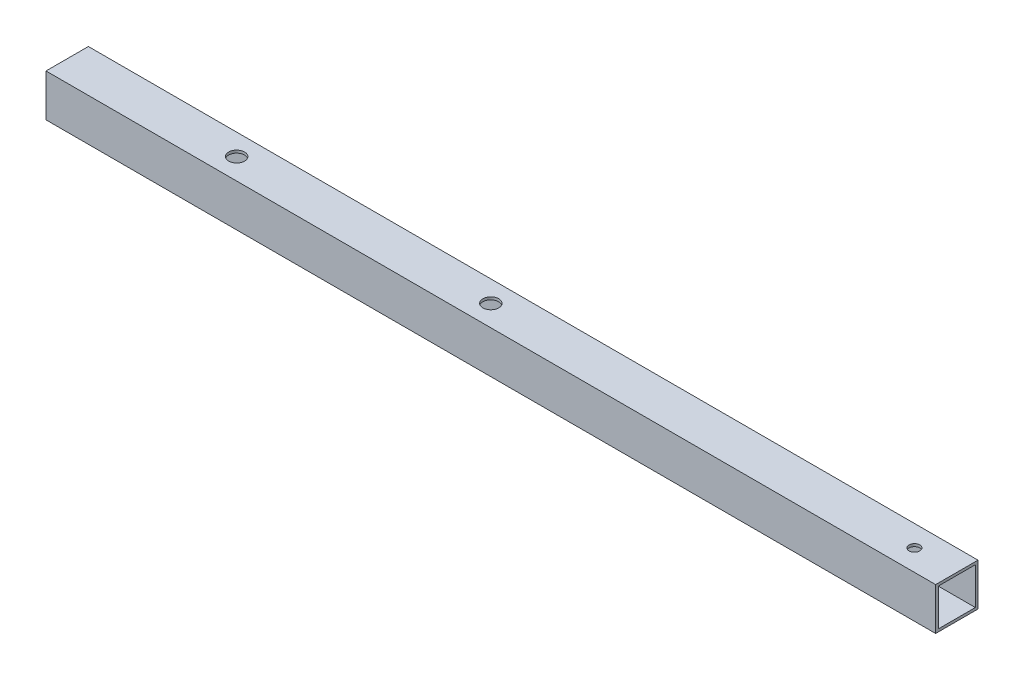
ISO-10303-21;
HEADER;
FILE_DESCRIPTION(('STEP AP214'),'2;1');
FILE_NAME('part.step','',(''),(''),'','','');
FILE_SCHEMA(('AUTOMOTIVE_DESIGN { 1 0 10303 214 1 1 1 1 }'));
ENDSEC;
DATA;
#1=APPLICATION_CONTEXT('core data for automotive mechanical design processes');
#2=APPLICATION_PROTOCOL_DEFINITION('international standard','automotive_design',2000,#1);
#3=PRODUCT_CONTEXT('',#1,'mechanical');
#4=PRODUCT('Part','Part','',(#3));
#5=PRODUCT_RELATED_PRODUCT_CATEGORY('part','',(#4));
#6=PRODUCT_DEFINITION_FORMATION('','',#4);
#7=PRODUCT_DEFINITION_CONTEXT('part definition',#1,'design');
#8=PRODUCT_DEFINITION('design','',#6,#7);
#9=PRODUCT_DEFINITION_SHAPE('','',#8);
#10=(LENGTH_UNIT() NAMED_UNIT(*) SI_UNIT(.MILLI.,.METRE.));
#11=(NAMED_UNIT(*) PLANE_ANGLE_UNIT() SI_UNIT($,.RADIAN.));
#12=(NAMED_UNIT(*) SI_UNIT($,.STERADIAN.) SOLID_ANGLE_UNIT());
#13=UNCERTAINTY_MEASURE_WITH_UNIT(LENGTH_MEASURE(1.E-05),#10,'distance_accuracy_value','');
#14=(GEOMETRIC_REPRESENTATION_CONTEXT(3) GLOBAL_UNCERTAINTY_ASSIGNED_CONTEXT((#13)) GLOBAL_UNIT_ASSIGNED_CONTEXT((#10,
#11,#12)) REPRESENTATION_CONTEXT('',''));
#15=CARTESIAN_POINT('',(0.,0.,0.));
#16=DIRECTION('',(0.,0.,1.));
#17=DIRECTION('',(1.,0.,0.));
#18=AXIS2_PLACEMENT_3D('',#15,#16,#17);
#19=CARTESIAN_POINT('',(533.4,0.,0.));
#20=DIRECTION('',(-1.,0.,0.));
#21=DIRECTION('',(0.,0.,1.));
#22=AXIS2_PLACEMENT_3D('',#19,#20,#21);
#23=PLANE('',#22);
#24=DIRECTION('',(0.,1.,0.));
#25=VECTOR('',#24,1.);
#26=CARTESIAN_POINT('',(533.4,-12.7,-12.7));
#27=LINE('',#26,#25);
#28=CARTESIAN_POINT('',(533.4,-12.7,-12.7));
#29=VERTEX_POINT('',#28);
#30=CARTESIAN_POINT('',(533.4,12.7,-12.7));
#31=VERTEX_POINT('',#30);
#32=EDGE_CURVE('E137',#29,#31,#27,.T.);
#33=ORIENTED_EDGE('',*,*,#32,.T.);
#34=DIRECTION('',(0.,0.,1.));
#35=VECTOR('',#34,1.);
#36=CARTESIAN_POINT('',(533.4,12.7,12.7));
#37=LINE('',#36,#35);
#38=CARTESIAN_POINT('',(533.4,12.7,12.7));
#39=VERTEX_POINT('',#38);
#40=EDGE_CURVE('E140',#31,#39,#37,.T.);
#41=ORIENTED_EDGE('',*,*,#40,.T.);
#42=DIRECTION('',(0.,-1.,0.));
#43=VECTOR('',#42,1.);
#44=CARTESIAN_POINT('',(533.4,-12.7,12.7));
#45=LINE('',#44,#43);
#46=CARTESIAN_POINT('',(533.4,-12.7,12.7));
#47=VERTEX_POINT('',#46);
#48=EDGE_CURVE('E143',#39,#47,#45,.T.);
#49=ORIENTED_EDGE('',*,*,#48,.T.);
#50=DIRECTION('',(0.,0.,-1.));
#51=VECTOR('',#50,1.);
#52=CARTESIAN_POINT('',(533.4,-12.7,12.7));
#53=LINE('',#52,#51);
#54=EDGE_CURVE('E145',#47,#29,#53,.T.);
#55=ORIENTED_EDGE('',*,*,#54,.T.);
#56=EDGE_LOOP('',(#33,#41,#49,#55));
#57=FACE_BOUND('',#56,.T.);
#58=DIRECTION('',(0.,1.,0.));
#59=VECTOR('',#58,1.);
#60=CARTESIAN_POINT('',(533.4,-11.1125,-11.1125));
#61=LINE('',#60,#59);
#62=CARTESIAN_POINT('',(533.4,-11.1125,-11.1125));
#63=VERTEX_POINT('',#62);
#64=CARTESIAN_POINT('',(533.4,11.1125,-11.1125));
#65=VERTEX_POINT('',#64);
#66=EDGE_CURVE('E99',#63,#65,#61,.T.);
#67=ORIENTED_EDGE('',*,*,#66,.F.);
#68=DIRECTION('',(0.,0.,-1.));
#69=VECTOR('',#68,1.);
#70=CARTESIAN_POINT('',(533.4,-11.1125,11.1125));
#71=LINE('',#70,#69);
#72=CARTESIAN_POINT('',(533.4,-11.1125,11.1125));
#73=VERTEX_POINT('',#72);
#74=EDGE_CURVE('E121',#73,#63,#71,.T.);
#75=ORIENTED_EDGE('',*,*,#74,.F.);
#76=DIRECTION('',(0.,-1.,0.));
#77=VECTOR('',#76,1.);
#78=CARTESIAN_POINT('',(533.4,-11.1125,11.1125));
#79=LINE('',#78,#77);
#80=CARTESIAN_POINT('',(533.4,11.1125,11.1125));
#81=VERTEX_POINT('',#80);
#82=EDGE_CURVE('E119',#81,#73,#79,.T.);
#83=ORIENTED_EDGE('',*,*,#82,.F.);
#84=DIRECTION('',(0.,0.,1.));
#85=VECTOR('',#84,1.);
#86=CARTESIAN_POINT('',(533.4,11.1125,11.1125));
#87=LINE('',#86,#85);
#88=EDGE_CURVE('E107',#65,#81,#87,.T.);
#89=ORIENTED_EDGE('',*,*,#88,.F.);
#90=EDGE_LOOP('',(#67,#75,#83,#89));
#91=FACE_BOUND('',#90,.T.);
#92=ADVANCED_FACE('F32',(#57,#91),#23,.F.);
#93=CARTESIAN_POINT('',(0.,0.,0.));
#94=DIRECTION('',(-1.,0.,0.));
#95=DIRECTION('',(0.,0.,1.));
#96=AXIS2_PLACEMENT_3D('',#93,#94,#95);
#97=PLANE('',#96);
#98=DIRECTION('',(0.,1.,0.));
#99=VECTOR('',#98,1.);
#100=CARTESIAN_POINT('',(0.,-12.7,-12.7));
#101=LINE('',#100,#99);
#102=CARTESIAN_POINT('',(0.,-12.7,-12.7));
#103=VERTEX_POINT('',#102);
#104=CARTESIAN_POINT('',(0.,12.7,-12.7));
#105=VERTEX_POINT('',#104);
#106=EDGE_CURVE('E115',#103,#105,#101,.T.);
#107=ORIENTED_EDGE('',*,*,#106,.F.);
#108=DIRECTION('',(0.,0.,-1.));
#109=VECTOR('',#108,1.);
#110=CARTESIAN_POINT('',(0.,-12.7,12.7));
#111=LINE('',#110,#109);
#112=CARTESIAN_POINT('',(0.,-12.7,12.7));
#113=VERTEX_POINT('',#112);
#114=EDGE_CURVE('E141',#113,#103,#111,.T.);
#115=ORIENTED_EDGE('',*,*,#114,.F.);
#116=DIRECTION('',(0.,-1.,0.));
#117=VECTOR('',#116,1.);
#118=CARTESIAN_POINT('',(0.,-12.7,12.7));
#119=LINE('',#118,#117);
#120=CARTESIAN_POINT('',(0.,12.7,12.7));
#121=VERTEX_POINT('',#120);
#122=EDGE_CURVE('E152',#121,#113,#119,.T.);
#123=ORIENTED_EDGE('',*,*,#122,.F.);
#124=DIRECTION('',(0.,0.,1.));
#125=VECTOR('',#124,1.);
#126=CARTESIAN_POINT('',(0.,12.7,12.7));
#127=LINE('',#126,#125);
#128=EDGE_CURVE('E150',#105,#121,#127,.T.);
#129=ORIENTED_EDGE('',*,*,#128,.F.);
#130=EDGE_LOOP('',(#107,#115,#123,#129));
#131=FACE_BOUND('',#130,.T.);
#132=DIRECTION('',(0.,0.,-1.));
#133=VECTOR('',#132,1.);
#134=CARTESIAN_POINT('',(0.,-11.1125,11.1125));
#135=LINE('',#134,#133);
#136=CARTESIAN_POINT('',(0.,-11.1125,11.1125));
#137=VERTEX_POINT('',#136);
#138=CARTESIAN_POINT('',(0.,-11.1125,-11.1125));
#139=VERTEX_POINT('',#138);
#140=EDGE_CURVE('E108',#137,#139,#135,.T.);
#141=ORIENTED_EDGE('',*,*,#140,.T.);
#142=DIRECTION('',(0.,1.,0.));
#143=VECTOR('',#142,1.);
#144=CARTESIAN_POINT('',(0.,-11.1125,-11.1125));
#145=LINE('',#144,#143);
#146=CARTESIAN_POINT('',(0.,11.1125,-11.1125));
#147=VERTEX_POINT('',#146);
#148=EDGE_CURVE('E57',#139,#147,#145,.T.);
#149=ORIENTED_EDGE('',*,*,#148,.T.);
#150=DIRECTION('',(0.,0.,1.));
#151=VECTOR('',#150,1.);
#152=CARTESIAN_POINT('',(0.,11.1125,11.1125));
#153=LINE('',#152,#151);
#154=CARTESIAN_POINT('',(0.,11.1125,11.1125));
#155=VERTEX_POINT('',#154);
#156=EDGE_CURVE('E114',#147,#155,#153,.T.);
#157=ORIENTED_EDGE('',*,*,#156,.T.);
#158=DIRECTION('',(0.,-1.,0.));
#159=VECTOR('',#158,1.);
#160=CARTESIAN_POINT('',(0.,-11.1125,11.1125));
#161=LINE('',#160,#159);
#162=EDGE_CURVE('E129',#155,#137,#161,.T.);
#163=ORIENTED_EDGE('',*,*,#162,.T.);
#164=EDGE_LOOP('',(#141,#149,#157,#163));
#165=FACE_BOUND('',#164,.T.);
#166=ADVANCED_FACE('F210',(#131,#165),#97,.T.);
#167=CARTESIAN_POINT('',(533.4,-12.7,-12.7));
#168=DIRECTION('',(0.,0.,1.));
#169=DIRECTION('',(1.,0.,0.));
#170=AXIS2_PLACEMENT_3D('',#167,#168,#169);
#171=PLANE('',#170);
#172=ORIENTED_EDGE('',*,*,#106,.T.);
#173=DIRECTION('',(-1.,0.,0.));
#174=VECTOR('',#173,1.);
#175=CARTESIAN_POINT('',(533.4,12.7,-12.7));
#176=LINE('',#175,#174);
#177=EDGE_CURVE('E11',#31,#105,#176,.T.);
#178=ORIENTED_EDGE('',*,*,#177,.F.);
#179=ORIENTED_EDGE('',*,*,#32,.F.);
#180=DIRECTION('',(-1.,0.,0.));
#181=VECTOR('',#180,1.);
#182=CARTESIAN_POINT('',(533.4,-12.7,-12.7));
#183=LINE('',#182,#181);
#184=EDGE_CURVE('E147',#29,#103,#183,.T.);
#185=ORIENTED_EDGE('',*,*,#184,.T.);
#186=EDGE_LOOP('',(#172,#178,#179,#185));
#187=FACE_BOUND('',#186,.T.);
#188=ADVANCED_FACE('F34',(#187),#171,.F.);
#189=CARTESIAN_POINT('',(533.4,12.7,12.7));
#190=DIRECTION('',(0.,-1.,0.));
#191=DIRECTION('',(0.,0.,-1.));
#192=AXIS2_PLACEMENT_3D('',#189,#190,#191);
#193=PLANE('',#192);
#194=CARTESIAN_POINT('',(508.,12.7,0.));
#195=DIRECTION('',(0.,1.,0.));
#196=DIRECTION('',(0.,0.,1.));
#197=AXIS2_PLACEMENT_3D('',#194,#195,#196);
#198=CIRCLE('',#197,3.17499999999997);
#199=CARTESIAN_POINT('',(508.,12.7,3.17499999999997));
#200=VERTEX_POINT('',#199);
#201=EDGE_CURVE('E235',#200,#200,#198,.T.);
#202=ORIENTED_EDGE('',*,*,#201,.F.);
#203=EDGE_LOOP('',(#202));
#204=FACE_BOUND('',#203,.T.);
#205=CARTESIAN_POINT('',(254.,12.7,0.));
#206=DIRECTION('',(0.,1.,0.));
#207=DIRECTION('',(0.,0.,1.));
#208=AXIS2_PLACEMENT_3D('',#205,#206,#207);
#209=CIRCLE('',#208,4.76250000000001);
#210=CARTESIAN_POINT('',(254.,12.7,4.76250000000001));
#211=VERTEX_POINT('',#210);
#212=EDGE_CURVE('E175',#211,#211,#209,.T.);
#213=ORIENTED_EDGE('',*,*,#212,.F.);
#214=EDGE_LOOP('',(#213));
#215=FACE_BOUND('',#214,.T.);
#216=CARTESIAN_POINT('',(101.6,12.7,0.));
#217=DIRECTION('',(0.,1.,0.));
#218=DIRECTION('',(0.,0.,1.));
#219=AXIS2_PLACEMENT_3D('',#216,#217,#218);
#220=CIRCLE('',#219,4.7625);
#221=CARTESIAN_POINT('',(101.6,12.7,4.7625));
#222=VERTEX_POINT('',#221);
#223=EDGE_CURVE('E172',#222,#222,#220,.T.);
#224=ORIENTED_EDGE('',*,*,#223,.F.);
#225=EDGE_LOOP('',(#224));
#226=FACE_BOUND('',#225,.T.);
#227=ORIENTED_EDGE('',*,*,#128,.T.);
#228=DIRECTION('',(-1.,0.,0.));
#229=VECTOR('',#228,1.);
#230=CARTESIAN_POINT('',(533.4,12.7,12.7));
#231=LINE('',#230,#229);
#232=EDGE_CURVE('E41',#39,#121,#231,.T.);
#233=ORIENTED_EDGE('',*,*,#232,.F.);
#234=ORIENTED_EDGE('',*,*,#40,.F.);
#235=ORIENTED_EDGE('',*,*,#177,.T.);
#236=EDGE_LOOP('',(#227,#233,#234,#235));
#237=FACE_BOUND('',#236,.T.);
#238=ADVANCED_FACE('F224',(#204,#215,#226,#237),#193,.F.);
#239=CARTESIAN_POINT('',(533.4,-12.7,12.7));
#240=DIRECTION('',(0.,0.,-1.));
#241=DIRECTION('',(-1.,0.,0.));
#242=AXIS2_PLACEMENT_3D('',#239,#240,#241);
#243=PLANE('',#242);
#244=ORIENTED_EDGE('',*,*,#122,.T.);
#245=DIRECTION('',(-1.,0.,0.));
#246=VECTOR('',#245,1.);
#247=CARTESIAN_POINT('',(533.4,-12.7,12.7));
#248=LINE('',#247,#246);
#249=EDGE_CURVE('E157',#47,#113,#248,.T.);
#250=ORIENTED_EDGE('',*,*,#249,.F.);
#251=ORIENTED_EDGE('',*,*,#48,.F.);
#252=ORIENTED_EDGE('',*,*,#232,.T.);
#253=EDGE_LOOP('',(#244,#250,#251,#252));
#254=FACE_BOUND('',#253,.T.);
#255=ADVANCED_FACE('F221',(#254),#243,.F.);
#256=CARTESIAN_POINT('',(533.4,-12.7,12.7));
#257=DIRECTION('',(0.,1.,0.));
#258=DIRECTION('',(0.,0.,1.));
#259=AXIS2_PLACEMENT_3D('',#256,#257,#258);
#260=PLANE('',#259);
#261=CARTESIAN_POINT('',(508.,-12.7,0.));
#262=DIRECTION('',(0.,1.,0.));
#263=DIRECTION('',(0.,0.,1.));
#264=AXIS2_PLACEMENT_3D('',#261,#262,#263);
#265=CIRCLE('',#264,3.17499999999997);
#266=CARTESIAN_POINT('',(508.,-12.7,3.17499999999997));
#267=VERTEX_POINT('',#266);
#268=EDGE_CURVE('E283',#267,#267,#265,.T.);
#269=ORIENTED_EDGE('',*,*,#268,.T.);
#270=EDGE_LOOP('',(#269));
#271=FACE_BOUND('',#270,.T.);
#272=CARTESIAN_POINT('',(254.,-12.7,0.));
#273=DIRECTION('',(0.,1.,0.));
#274=DIRECTION('',(0.,0.,1.));
#275=AXIS2_PLACEMENT_3D('',#272,#273,#274);
#276=CIRCLE('',#275,4.76250000000001);
#277=CARTESIAN_POINT('',(254.,-12.7,4.76250000000001));
#278=VERTEX_POINT('',#277);
#279=EDGE_CURVE('E168',#278,#278,#276,.T.);
#280=ORIENTED_EDGE('',*,*,#279,.T.);
#281=EDGE_LOOP('',(#280));
#282=FACE_BOUND('',#281,.T.);
#283=CARTESIAN_POINT('',(101.6,-12.7,0.));
#284=DIRECTION('',(0.,1.,0.));
#285=DIRECTION('',(0.,0.,1.));
#286=AXIS2_PLACEMENT_3D('',#283,#284,#285);
#287=CIRCLE('',#286,4.7625);
#288=CARTESIAN_POINT('',(101.6,-12.7,4.7625));
#289=VERTEX_POINT('',#288);
#290=EDGE_CURVE('E164',#289,#289,#287,.T.);
#291=ORIENTED_EDGE('',*,*,#290,.T.);
#292=EDGE_LOOP('',(#291));
#293=FACE_BOUND('',#292,.T.);
#294=ORIENTED_EDGE('',*,*,#114,.T.);
#295=ORIENTED_EDGE('',*,*,#184,.F.);
#296=ORIENTED_EDGE('',*,*,#54,.F.);
#297=ORIENTED_EDGE('',*,*,#249,.T.);
#298=EDGE_LOOP('',(#294,#295,#296,#297));
#299=FACE_BOUND('',#298,.T.);
#300=ADVANCED_FACE('F205',(#271,#282,#293,#299),#260,.F.);
#301=CARTESIAN_POINT('',(533.4,-11.1125,-11.1125));
#302=DIRECTION('',(0.,0.,1.));
#303=DIRECTION('',(1.,0.,0.));
#304=AXIS2_PLACEMENT_3D('',#301,#302,#303);
#305=PLANE('',#304);
#306=ORIENTED_EDGE('',*,*,#148,.F.);
#307=DIRECTION('',(-1.,0.,0.));
#308=VECTOR('',#307,1.);
#309=CARTESIAN_POINT('',(533.4,-11.1125,-11.1125));
#310=LINE('',#309,#308);
#311=EDGE_CURVE('E103',#63,#139,#310,.T.);
#312=ORIENTED_EDGE('',*,*,#311,.F.);
#313=ORIENTED_EDGE('',*,*,#66,.T.);
#314=DIRECTION('',(-1.,0.,0.));
#315=VECTOR('',#314,1.);
#316=CARTESIAN_POINT('',(533.4,11.1125,-11.1125));
#317=LINE('',#316,#315);
#318=EDGE_CURVE('E102',#65,#147,#317,.T.);
#319=ORIENTED_EDGE('',*,*,#318,.T.);
#320=EDGE_LOOP('',(#306,#312,#313,#319));
#321=FACE_BOUND('',#320,.T.);
#322=ADVANCED_FACE('F101',(#321),#305,.T.);
#323=CARTESIAN_POINT('',(533.4,11.1125,11.1125));
#324=DIRECTION('',(0.,-1.,0.));
#325=DIRECTION('',(0.,0.,-1.));
#326=AXIS2_PLACEMENT_3D('',#323,#324,#325);
#327=PLANE('',#326);
#328=CARTESIAN_POINT('',(508.,11.1125,0.));
#329=DIRECTION('',(0.,-1.,0.));
#330=DIRECTION('',(0.,0.,-1.));
#331=AXIS2_PLACEMENT_3D('',#328,#329,#330);
#332=CIRCLE('',#331,3.17499999999997);
#333=CARTESIAN_POINT('',(508.,11.1125,-3.17499999999997));
#334=VERTEX_POINT('',#333);
#335=EDGE_CURVE('E180',#334,#334,#332,.T.);
#336=ORIENTED_EDGE('',*,*,#335,.F.);
#337=EDGE_LOOP('',(#336));
#338=FACE_BOUND('',#337,.T.);
#339=CARTESIAN_POINT('',(254.,11.1125,0.));
#340=DIRECTION('',(0.,-1.,0.));
#341=DIRECTION('',(0.,0.,-1.));
#342=AXIS2_PLACEMENT_3D('',#339,#340,#341);
#343=CIRCLE('',#342,4.76250000000001);
#344=CARTESIAN_POINT('',(254.,11.1125,-4.76250000000001));
#345=VERTEX_POINT('',#344);
#346=EDGE_CURVE('E167',#345,#345,#343,.T.);
#347=ORIENTED_EDGE('',*,*,#346,.F.);
#348=EDGE_LOOP('',(#347));
#349=FACE_BOUND('',#348,.T.);
#350=CARTESIAN_POINT('',(101.6,11.1125,0.));
#351=DIRECTION('',(0.,-1.,0.));
#352=DIRECTION('',(0.,0.,-1.));
#353=AXIS2_PLACEMENT_3D('',#350,#351,#352);
#354=CIRCLE('',#353,4.7625);
#355=CARTESIAN_POINT('',(101.6,11.1125,-4.7625));
#356=VERTEX_POINT('',#355);
#357=EDGE_CURVE('E127',#356,#356,#354,.T.);
#358=ORIENTED_EDGE('',*,*,#357,.F.);
#359=EDGE_LOOP('',(#358));
#360=FACE_BOUND('',#359,.T.);
#361=ORIENTED_EDGE('',*,*,#156,.F.);
#362=ORIENTED_EDGE('',*,*,#318,.F.);
#363=ORIENTED_EDGE('',*,*,#88,.T.);
#364=DIRECTION('',(-1.,0.,0.));
#365=VECTOR('',#364,1.);
#366=CARTESIAN_POINT('',(533.4,11.1125,11.1125));
#367=LINE('',#366,#365);
#368=EDGE_CURVE('E116',#81,#155,#367,.T.);
#369=ORIENTED_EDGE('',*,*,#368,.T.);
#370=EDGE_LOOP('',(#361,#362,#363,#369));
#371=FACE_BOUND('',#370,.T.);
#372=ADVANCED_FACE('F111',(#338,#349,#360,#371),#327,.T.);
#373=CARTESIAN_POINT('',(533.4,-11.1125,11.1125));
#374=DIRECTION('',(0.,0.,-1.));
#375=DIRECTION('',(-1.,0.,0.));
#376=AXIS2_PLACEMENT_3D('',#373,#374,#375);
#377=PLANE('',#376);
#378=ORIENTED_EDGE('',*,*,#162,.F.);
#379=ORIENTED_EDGE('',*,*,#368,.F.);
#380=ORIENTED_EDGE('',*,*,#82,.T.);
#381=DIRECTION('',(-1.,0.,0.));
#382=VECTOR('',#381,1.);
#383=CARTESIAN_POINT('',(533.4,-11.1125,11.1125));
#384=LINE('',#383,#382);
#385=EDGE_CURVE('E49',#73,#137,#384,.T.);
#386=ORIENTED_EDGE('',*,*,#385,.T.);
#387=EDGE_LOOP('',(#378,#379,#380,#386));
#388=FACE_BOUND('',#387,.T.);
#389=ADVANCED_FACE('F195',(#388),#377,.T.);
#390=CARTESIAN_POINT('',(533.4,-11.1125,11.1125));
#391=DIRECTION('',(0.,1.,0.));
#392=DIRECTION('',(0.,0.,1.));
#393=AXIS2_PLACEMENT_3D('',#390,#391,#392);
#394=PLANE('',#393);
#395=CARTESIAN_POINT('',(508.,-11.1125,0.));
#396=DIRECTION('',(0.,1.,0.));
#397=DIRECTION('',(0.,0.,1.));
#398=AXIS2_PLACEMENT_3D('',#395,#396,#397);
#399=CIRCLE('',#398,3.17499999999997);
#400=CARTESIAN_POINT('',(508.,-11.1125,3.17499999999997));
#401=VERTEX_POINT('',#400);
#402=EDGE_CURVE('E36',#401,#401,#399,.T.);
#403=ORIENTED_EDGE('',*,*,#402,.F.);
#404=EDGE_LOOP('',(#403));
#405=FACE_BOUND('',#404,.T.);
#406=CARTESIAN_POINT('',(254.,-11.1125,0.));
#407=DIRECTION('',(0.,1.,0.));
#408=DIRECTION('',(0.,0.,1.));
#409=AXIS2_PLACEMENT_3D('',#406,#407,#408);
#410=CIRCLE('',#409,4.76250000000001);
#411=CARTESIAN_POINT('',(254.,-11.1125,4.76250000000001));
#412=VERTEX_POINT('',#411);
#413=EDGE_CURVE('E165',#412,#412,#410,.T.);
#414=ORIENTED_EDGE('',*,*,#413,.F.);
#415=EDGE_LOOP('',(#414));
#416=FACE_BOUND('',#415,.T.);
#417=CARTESIAN_POINT('',(101.6,-11.1125,0.));
#418=DIRECTION('',(0.,1.,0.));
#419=DIRECTION('',(0.,0.,1.));
#420=AXIS2_PLACEMENT_3D('',#417,#418,#419);
#421=CIRCLE('',#420,4.7625);
#422=CARTESIAN_POINT('',(101.6,-11.1125,4.7625));
#423=VERTEX_POINT('',#422);
#424=EDGE_CURVE('E162',#423,#423,#421,.T.);
#425=ORIENTED_EDGE('',*,*,#424,.F.);
#426=EDGE_LOOP('',(#425));
#427=FACE_BOUND('',#426,.T.);
#428=ORIENTED_EDGE('',*,*,#140,.F.);
#429=ORIENTED_EDGE('',*,*,#385,.F.);
#430=ORIENTED_EDGE('',*,*,#74,.T.);
#431=ORIENTED_EDGE('',*,*,#311,.T.);
#432=EDGE_LOOP('',(#428,#429,#430,#431));
#433=FACE_BOUND('',#432,.T.);
#434=ADVANCED_FACE('F202',(#405,#416,#427,#433),#394,.T.);
#435=CARTESIAN_POINT('',(101.6,-12.7,0.));
#436=DIRECTION('',(0.,1.,0.));
#437=DIRECTION('',(0.,0.,1.));
#438=AXIS2_PLACEMENT_3D('',#435,#436,#437);
#439=CYLINDRICAL_SURFACE('',#438,4.7625);
#440=ORIENTED_EDGE('',*,*,#424,.T.);
#441=EDGE_LOOP('',(#440));
#442=FACE_BOUND('',#441,.T.);
#443=ORIENTED_EDGE('',*,*,#290,.F.);
#444=EDGE_LOOP('',(#443));
#445=FACE_BOUND('',#444,.T.);
#446=ADVANCED_FACE('F254',(#442,#445),#439,.F.);
#447=ORIENTED_EDGE('',*,*,#357,.T.);
#448=EDGE_LOOP('',(#447));
#449=FACE_BOUND('',#448,.T.);
#450=ORIENTED_EDGE('',*,*,#223,.T.);
#451=EDGE_LOOP('',(#450));
#452=FACE_BOUND('',#451,.T.);
#453=ADVANCED_FACE('F191',(#449,#452),#439,.F.);
#454=CARTESIAN_POINT('',(254.,-12.7,0.));
#455=DIRECTION('',(0.,1.,0.));
#456=DIRECTION('',(0.,0.,1.));
#457=AXIS2_PLACEMENT_3D('',#454,#455,#456);
#458=CYLINDRICAL_SURFACE('',#457,4.76250000000001);
#459=ORIENTED_EDGE('',*,*,#413,.T.);
#460=EDGE_LOOP('',(#459));
#461=FACE_BOUND('',#460,.T.);
#462=ORIENTED_EDGE('',*,*,#279,.F.);
#463=EDGE_LOOP('',(#462));
#464=FACE_BOUND('',#463,.T.);
#465=ADVANCED_FACE('F265',(#461,#464),#458,.F.);
#466=ORIENTED_EDGE('',*,*,#346,.T.);
#467=EDGE_LOOP('',(#466));
#468=FACE_BOUND('',#467,.T.);
#469=ORIENTED_EDGE('',*,*,#212,.T.);
#470=EDGE_LOOP('',(#469));
#471=FACE_BOUND('',#470,.T.);
#472=ADVANCED_FACE('F268',(#468,#471),#458,.F.);
#473=CARTESIAN_POINT('',(508.,-12.7,0.));
#474=DIRECTION('',(0.,1.,0.));
#475=DIRECTION('',(0.,0.,1.));
#476=AXIS2_PLACEMENT_3D('',#473,#474,#475);
#477=CYLINDRICAL_SURFACE('',#476,3.17499999999997);
#478=ORIENTED_EDGE('',*,*,#402,.T.);
#479=EDGE_LOOP('',(#478));
#480=FACE_BOUND('',#479,.T.);
#481=ORIENTED_EDGE('',*,*,#268,.F.);
#482=EDGE_LOOP('',(#481));
#483=FACE_BOUND('',#482,.T.);
#484=ADVANCED_FACE('F269',(#480,#483),#477,.F.);
#485=ORIENTED_EDGE('',*,*,#335,.T.);
#486=EDGE_LOOP('',(#485));
#487=FACE_BOUND('',#486,.T.);
#488=ORIENTED_EDGE('',*,*,#201,.T.);
#489=EDGE_LOOP('',(#488));
#490=FACE_BOUND('',#489,.T.);
#491=ADVANCED_FACE('F271',(#487,#490),#477,.F.);
#492=CLOSED_SHELL('',(#92,#166,#188,#238,#255,#300,#322,#372,#389,#434,#446,#453,#465,#472,#484,#491));
#493=MANIFOLD_SOLID_BREP('B2',#492);
#494=ADVANCED_BREP_SHAPE_REPRESENTATION('',(#18,#493),#14);
#495=SHAPE_DEFINITION_REPRESENTATION(#9,#494);
ENDSEC;
END-ISO-10303-21;
